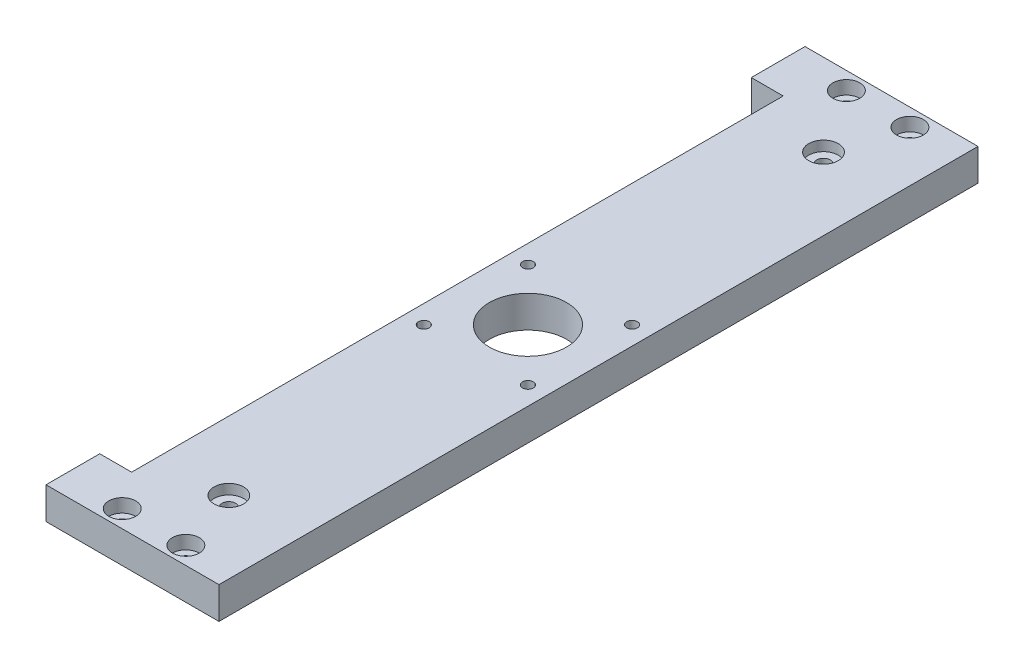
ISO-10303-21;
HEADER;
FILE_DESCRIPTION(('STEP AP214'),'2;1');
FILE_NAME('part.step','',(''),(''),'','','');
FILE_SCHEMA(('AUTOMOTIVE_DESIGN { 1 0 10303 214 1 1 1 1 }'));
ENDSEC;
DATA;
#1=APPLICATION_CONTEXT('core data for automotive mechanical design processes');
#2=APPLICATION_PROTOCOL_DEFINITION('international standard','automotive_design',2000,#1);
#3=PRODUCT_CONTEXT('',#1,'mechanical');
#4=PRODUCT('Part','Part','',(#3));
#5=PRODUCT_RELATED_PRODUCT_CATEGORY('part','',(#4));
#6=PRODUCT_DEFINITION_FORMATION('','',#4);
#7=PRODUCT_DEFINITION_CONTEXT('part definition',#1,'design');
#8=PRODUCT_DEFINITION('design','',#6,#7);
#9=PRODUCT_DEFINITION_SHAPE('','',#8);
#10=(LENGTH_UNIT() NAMED_UNIT(*) SI_UNIT(.MILLI.,.METRE.));
#11=(NAMED_UNIT(*) PLANE_ANGLE_UNIT() SI_UNIT($,.RADIAN.));
#12=(NAMED_UNIT(*) SI_UNIT($,.STERADIAN.) SOLID_ANGLE_UNIT());
#13=UNCERTAINTY_MEASURE_WITH_UNIT(LENGTH_MEASURE(1.E-05),#10,'distance_accuracy_value','');
#14=(GEOMETRIC_REPRESENTATION_CONTEXT(3) GLOBAL_UNCERTAINTY_ASSIGNED_CONTEXT((#13)) GLOBAL_UNIT_ASSIGNED_CONTEXT((#10,
#11,#12)) REPRESENTATION_CONTEXT('',''));
#15=CARTESIAN_POINT('',(0.,0.,0.));
#16=DIRECTION('',(0.,0.,1.));
#17=DIRECTION('',(1.,0.,0.));
#18=AXIS2_PLACEMENT_3D('',#15,#16,#17);
#19=CARTESIAN_POINT('',(26.9389173415036,0.,5.20000000000004));
#20=DIRECTION('',(0.,1.,0.));
#21=DIRECTION('',(0.,0.,1.));
#22=AXIS2_PLACEMENT_3D('',#19,#20,#21);
#23=CYLINDRICAL_SURFACE('',#22,1.9);
#24=CARTESIAN_POINT('',(26.9389173415036,0.,5.20000000000004));
#25=DIRECTION('',(0.,-1.,0.));
#26=DIRECTION('',(0.,0.,-1.));
#27=AXIS2_PLACEMENT_3D('',#24,#25,#26);
#28=CIRCLE('',#27,1.9);
#29=CARTESIAN_POINT('',(26.9389173415036,0.,3.30000000000004));
#30=VERTEX_POINT('',#29);
#31=EDGE_CURVE('E195',#30,#30,#28,.T.);
#32=ORIENTED_EDGE('',*,*,#31,.T.);
#33=EDGE_LOOP('',(#32));
#34=FACE_BOUND('',#33,.T.);
#35=CARTESIAN_POINT('',(26.9389173415036,5.5,5.20000000000004));
#36=DIRECTION('',(0.,1.,0.));
#37=DIRECTION('',(0.,0.,1.));
#38=AXIS2_PLACEMENT_3D('',#35,#36,#37);
#39=CIRCLE('',#38,1.9);
#40=CARTESIAN_POINT('',(26.9389173415036,5.5,7.10000000000004));
#41=VERTEX_POINT('',#40);
#42=EDGE_CURVE('E39',#41,#41,#39,.T.);
#43=ORIENTED_EDGE('',*,*,#42,.T.);
#44=EDGE_LOOP('',(#43));
#45=FACE_BOUND('',#44,.T.);
#46=ADVANCED_FACE('F35',(#34,#45),#23,.F.);
#47=CARTESIAN_POINT('',(8.00000000000001,0.,5.20000000000004));
#48=DIRECTION('',(0.,1.,0.));
#49=DIRECTION('',(0.,0.,1.));
#50=AXIS2_PLACEMENT_3D('',#47,#48,#49);
#51=CYLINDRICAL_SURFACE('',#50,1.9);
#52=CARTESIAN_POINT('',(8.00000000000001,0.,5.20000000000004));
#53=DIRECTION('',(0.,-1.,0.));
#54=DIRECTION('',(0.,0.,-1.));
#55=AXIS2_PLACEMENT_3D('',#52,#53,#54);
#56=CIRCLE('',#55,1.9);
#57=CARTESIAN_POINT('',(8.00000000000001,0.,3.30000000000003));
#58=VERTEX_POINT('',#57);
#59=EDGE_CURVE('E210',#58,#58,#56,.T.);
#60=ORIENTED_EDGE('',*,*,#59,.T.);
#61=EDGE_LOOP('',(#60));
#62=FACE_BOUND('',#61,.T.);
#63=CARTESIAN_POINT('',(8.00000000000001,5.5,5.20000000000004));
#64=DIRECTION('',(0.,1.,0.));
#65=DIRECTION('',(0.,0.,1.));
#66=AXIS2_PLACEMENT_3D('',#63,#64,#65);
#67=CIRCLE('',#66,1.9);
#68=CARTESIAN_POINT('',(8.00000000000001,5.5,7.10000000000004));
#69=VERTEX_POINT('',#68);
#70=EDGE_CURVE('E189',#69,#69,#67,.T.);
#71=ORIENTED_EDGE('',*,*,#70,.T.);
#72=EDGE_LOOP('',(#71));
#73=FACE_BOUND('',#72,.T.);
#74=ADVANCED_FACE('F297',(#62,#73),#51,.F.);
#75=CARTESIAN_POINT('',(26.9389173415036,0.,220.8));
#76=DIRECTION('',(0.,1.,0.));
#77=DIRECTION('',(0.,0.,1.));
#78=AXIS2_PLACEMENT_3D('',#75,#76,#77);
#79=CYLINDRICAL_SURFACE('',#78,1.9);
#80=CARTESIAN_POINT('',(26.9389173415036,0.,220.8));
#81=DIRECTION('',(0.,1.,0.));
#82=DIRECTION('',(0.,0.,1.));
#83=AXIS2_PLACEMENT_3D('',#80,#81,#82);
#84=CIRCLE('',#83,1.9);
#85=CARTESIAN_POINT('',(26.9389173415036,0.,222.7));
#86=VERTEX_POINT('',#85);
#87=EDGE_CURVE('E188',#86,#86,#84,.T.);
#88=ORIENTED_EDGE('',*,*,#87,.F.);
#89=EDGE_LOOP('',(#88));
#90=FACE_BOUND('',#89,.T.);
#91=CARTESIAN_POINT('',(26.9389173415036,5.5,220.8));
#92=DIRECTION('',(0.,1.,0.));
#93=DIRECTION('',(0.,0.,1.));
#94=AXIS2_PLACEMENT_3D('',#91,#92,#93);
#95=CIRCLE('',#94,1.9);
#96=CARTESIAN_POINT('',(26.9389173415036,5.5,222.7));
#97=VERTEX_POINT('',#96);
#98=EDGE_CURVE('E185',#97,#97,#95,.F.);
#99=ORIENTED_EDGE('',*,*,#98,.F.);
#100=EDGE_LOOP('',(#99));
#101=FACE_BOUND('',#100,.T.);
#102=ADVANCED_FACE('F304',(#90,#101),#79,.F.);
#103=CARTESIAN_POINT('',(8.00000000000001,0.,220.8));
#104=DIRECTION('',(0.,1.,0.));
#105=DIRECTION('',(0.,0.,1.));
#106=AXIS2_PLACEMENT_3D('',#103,#104,#105);
#107=CYLINDRICAL_SURFACE('',#106,1.9);
#108=CARTESIAN_POINT('',(8.00000000000001,0.,220.8));
#109=DIRECTION('',(0.,1.,0.));
#110=DIRECTION('',(0.,0.,1.));
#111=AXIS2_PLACEMENT_3D('',#108,#109,#110);
#112=CIRCLE('',#111,1.9);
#113=CARTESIAN_POINT('',(8.00000000000001,0.,222.7));
#114=VERTEX_POINT('',#113);
#115=EDGE_CURVE('E226',#114,#114,#112,.T.);
#116=ORIENTED_EDGE('',*,*,#115,.F.);
#117=EDGE_LOOP('',(#116));
#118=FACE_BOUND('',#117,.T.);
#119=CARTESIAN_POINT('',(8.00000000000001,5.5,220.8));
#120=DIRECTION('',(0.,1.,0.));
#121=DIRECTION('',(0.,0.,1.));
#122=AXIS2_PLACEMENT_3D('',#119,#120,#121);
#123=CIRCLE('',#122,1.9);
#124=CARTESIAN_POINT('',(8.00000000000001,5.5,222.7));
#125=VERTEX_POINT('',#124);
#126=EDGE_CURVE('E182',#125,#125,#123,.F.);
#127=ORIENTED_EDGE('',*,*,#126,.F.);
#128=EDGE_LOOP('',(#127));
#129=FACE_BOUND('',#128,.T.);
#130=ADVANCED_FACE('F328',(#118,#129),#107,.F.);
#131=CARTESIAN_POINT('',(0.,9.5,0.));
#132=DIRECTION('',(1.,0.,0.));
#133=DIRECTION('',(0.,0.,-1.));
#134=AXIS2_PLACEMENT_3D('',#131,#132,#133);
#135=PLANE('',#134);
#136=DIRECTION('',(0.,-1.,0.));
#137=VECTOR('',#136,1.);
#138=CARTESIAN_POINT('',(0.,0.,210.));
#139=LINE('',#138,#137);
#140=CARTESIAN_POINT('',(0.,9.5,210.));
#141=VERTEX_POINT('',#140);
#142=CARTESIAN_POINT('',(0.,0.,210.));
#143=VERTEX_POINT('',#142);
#144=EDGE_CURVE('E52',#141,#143,#139,.T.);
#145=ORIENTED_EDGE('',*,*,#144,.F.);
#146=DIRECTION('',(0.,0.,1.));
#147=VECTOR('',#146,1.);
#148=CARTESIAN_POINT('',(0.,9.5,0.));
#149=LINE('',#148,#147);
#150=CARTESIAN_POINT('',(0.,9.5,16.));
#151=VERTEX_POINT('',#150);
#152=EDGE_CURVE('E108',#151,#141,#149,.T.);
#153=ORIENTED_EDGE('',*,*,#152,.F.);
#154=DIRECTION('',(0.,1.,0.));
#155=VECTOR('',#154,1.);
#156=CARTESIAN_POINT('',(0.,9.5,16.));
#157=LINE('',#156,#155);
#158=CARTESIAN_POINT('',(0.,0.,16.));
#159=VERTEX_POINT('',#158);
#160=EDGE_CURVE('E136',#159,#151,#157,.T.);
#161=ORIENTED_EDGE('',*,*,#160,.F.);
#162=DIRECTION('',(0.,0.,1.));
#163=VECTOR('',#162,1.);
#164=CARTESIAN_POINT('',(0.,0.,0.));
#165=LINE('',#164,#163);
#166=EDGE_CURVE('E57',#159,#143,#165,.T.);
#167=ORIENTED_EDGE('',*,*,#166,.T.);
#168=EDGE_LOOP('',(#145,#153,#161,#167));
#169=FACE_BOUND('',#168,.T.);
#170=ADVANCED_FACE('F37',(#169),#135,.F.);
#171=CARTESIAN_POINT('',(0.,9.5,226.));
#172=DIRECTION('',(0.,0.,-1.));
#173=DIRECTION('',(-1.,0.,0.));
#174=AXIS2_PLACEMENT_3D('',#171,#172,#173);
#175=PLANE('',#174);
#176=DIRECTION('',(1.,0.,0.));
#177=VECTOR('',#176,1.);
#178=CARTESIAN_POINT('',(0.,0.,226.));
#179=LINE('',#178,#177);
#180=CARTESIAN_POINT('',(-9.49999999999993,0.,226.));
#181=VERTEX_POINT('',#180);
#182=CARTESIAN_POINT('',(42.0000000000001,0.,226.));
#183=VERTEX_POINT('',#182);
#184=EDGE_CURVE('E167',#181,#183,#179,.T.);
#185=ORIENTED_EDGE('',*,*,#184,.T.);
#186=DIRECTION('',(0.,-1.,0.));
#187=VECTOR('',#186,1.);
#188=CARTESIAN_POINT('',(42.0000000000001,9.5,226.));
#189=LINE('',#188,#187);
#190=CARTESIAN_POINT('',(42.0000000000001,9.5,226.));
#191=VERTEX_POINT('',#190);
#192=EDGE_CURVE('E11',#191,#183,#189,.T.);
#193=ORIENTED_EDGE('',*,*,#192,.F.);
#194=DIRECTION('',(1.,0.,0.));
#195=VECTOR('',#194,1.);
#196=CARTESIAN_POINT('',(0.,9.5,226.));
#197=LINE('',#196,#195);
#198=CARTESIAN_POINT('',(-9.49999999999993,9.5,226.));
#199=VERTEX_POINT('',#198);
#200=EDGE_CURVE('E100',#199,#191,#197,.T.);
#201=ORIENTED_EDGE('',*,*,#200,.F.);
#202=DIRECTION('',(0.,1.,0.));
#203=VECTOR('',#202,1.);
#204=CARTESIAN_POINT('',(-9.49999999999993,0.,226.));
#205=LINE('',#204,#203);
#206=EDGE_CURVE('E104',#181,#199,#205,.T.);
#207=ORIENTED_EDGE('',*,*,#206,.F.);
#208=EDGE_LOOP('',(#185,#193,#201,#207));
#209=FACE_BOUND('',#208,.T.);
#210=ADVANCED_FACE('F102',(#209),#175,.F.);
#211=CARTESIAN_POINT('',(42.,9.5,0.));
#212=DIRECTION('',(-1.,0.,0.));
#213=DIRECTION('',(0.,0.,1.));
#214=AXIS2_PLACEMENT_3D('',#211,#212,#213);
#215=PLANE('',#214);
#216=DIRECTION('',(0.,0.,-1.));
#217=VECTOR('',#216,1.);
#218=CARTESIAN_POINT('',(42.,0.,0.));
#219=LINE('',#218,#217);
#220=CARTESIAN_POINT('',(42.,0.,0.));
#221=VERTEX_POINT('',#220);
#222=EDGE_CURVE('E169',#183,#221,#219,.T.);
#223=ORIENTED_EDGE('',*,*,#222,.T.);
#224=DIRECTION('',(0.,-1.,0.));
#225=VECTOR('',#224,1.);
#226=CARTESIAN_POINT('',(42.,9.5,0.));
#227=LINE('',#226,#225);
#228=CARTESIAN_POINT('',(42.,9.5,0.));
#229=VERTEX_POINT('',#228);
#230=EDGE_CURVE('E44',#229,#221,#227,.T.);
#231=ORIENTED_EDGE('',*,*,#230,.F.);
#232=DIRECTION('',(0.,0.,-1.));
#233=VECTOR('',#232,1.);
#234=CARTESIAN_POINT('',(42.,9.5,0.));
#235=LINE('',#234,#233);
#236=EDGE_CURVE('E107',#191,#229,#235,.T.);
#237=ORIENTED_EDGE('',*,*,#236,.F.);
#238=ORIENTED_EDGE('',*,*,#192,.T.);
#239=EDGE_LOOP('',(#223,#231,#237,#238));
#240=FACE_BOUND('',#239,.T.);
#241=ADVANCED_FACE('F395',(#240),#215,.F.);
#242=CARTESIAN_POINT('',(0.,9.5,0.));
#243=DIRECTION('',(0.,0.,1.));
#244=DIRECTION('',(1.,0.,0.));
#245=AXIS2_PLACEMENT_3D('',#242,#243,#244);
#246=PLANE('',#245);
#247=DIRECTION('',(-1.,0.,0.));
#248=VECTOR('',#247,1.);
#249=CARTESIAN_POINT('',(0.,0.,0.));
#250=LINE('',#249,#248);
#251=CARTESIAN_POINT('',(-9.5,0.,0.));
#252=VERTEX_POINT('',#251);
#253=EDGE_CURVE('E161',#221,#252,#250,.T.);
#254=ORIENTED_EDGE('',*,*,#253,.T.);
#255=DIRECTION('',(0.,-1.,0.));
#256=VECTOR('',#255,1.);
#257=CARTESIAN_POINT('',(-9.5,9.5,0.));
#258=LINE('',#257,#256);
#259=CARTESIAN_POINT('',(-9.5,9.5,0.));
#260=VERTEX_POINT('',#259);
#261=EDGE_CURVE('E137',#260,#252,#258,.T.);
#262=ORIENTED_EDGE('',*,*,#261,.F.);
#263=DIRECTION('',(-1.,0.,0.));
#264=VECTOR('',#263,1.);
#265=CARTESIAN_POINT('',(0.,9.5,0.));
#266=LINE('',#265,#264);
#267=EDGE_CURVE('E164',#229,#260,#266,.T.);
#268=ORIENTED_EDGE('',*,*,#267,.F.);
#269=ORIENTED_EDGE('',*,*,#230,.T.);
#270=EDGE_LOOP('',(#254,#262,#268,#269));
#271=FACE_BOUND('',#270,.T.);
#272=ADVANCED_FACE('F275',(#271),#246,.F.);
#273=CARTESIAN_POINT('',(0.,9.5,0.));
#274=DIRECTION('',(0.,1.,0.));
#275=DIRECTION('',(0.,0.,1.));
#276=AXIS2_PLACEMENT_3D('',#273,#274,#275);
#277=PLANE('',#276);
#278=CARTESIAN_POINT('',(8.00000000000001,9.5,5.20000000000004));
#279=DIRECTION('',(0.,-1.,0.));
#280=DIRECTION('',(0.,0.,-1.));
#281=AXIS2_PLACEMENT_3D('',#278,#279,#280);
#282=CIRCLE('',#281,4.);
#283=CARTESIAN_POINT('',(8.00000000000001,9.5,1.20000000000004));
#284=VERTEX_POINT('',#283);
#285=EDGE_CURVE('E197',#284,#284,#282,.T.);
#286=ORIENTED_EDGE('',*,*,#285,.T.);
#287=EDGE_LOOP('',(#286));
#288=FACE_BOUND('',#287,.T.);
#289=CARTESIAN_POINT('',(26.9389173415036,9.5,5.20000000000004));
#290=DIRECTION('',(0.,-1.,0.));
#291=DIRECTION('',(0.,0.,-1.));
#292=AXIS2_PLACEMENT_3D('',#289,#290,#291);
#293=CIRCLE('',#292,4.);
#294=CARTESIAN_POINT('',(26.9389173415036,9.5,1.20000000000004));
#295=VERTEX_POINT('',#294);
#296=EDGE_CURVE('E207',#295,#295,#293,.T.);
#297=ORIENTED_EDGE('',*,*,#296,.T.);
#298=EDGE_LOOP('',(#297));
#299=FACE_BOUND('',#298,.T.);
#300=CARTESIAN_POINT('',(8.00000000000001,9.5,220.8));
#301=DIRECTION('',(0.,1.,0.));
#302=DIRECTION('',(0.,0.,1.));
#303=AXIS2_PLACEMENT_3D('',#300,#301,#302);
#304=CIRCLE('',#303,4.);
#305=CARTESIAN_POINT('',(8.00000000000001,9.5,224.8));
#306=VERTEX_POINT('',#305);
#307=EDGE_CURVE('E218',#306,#306,#304,.T.);
#308=ORIENTED_EDGE('',*,*,#307,.F.);
#309=EDGE_LOOP('',(#308));
#310=FACE_BOUND('',#309,.T.);
#311=CARTESIAN_POINT('',(26.9389173415036,9.5,220.8));
#312=DIRECTION('',(0.,1.,0.));
#313=DIRECTION('',(0.,0.,1.));
#314=AXIS2_PLACEMENT_3D('',#311,#312,#313);
#315=CIRCLE('',#314,4.);
#316=CARTESIAN_POINT('',(26.9389173415036,9.5,224.8));
#317=VERTEX_POINT('',#316);
#318=EDGE_CURVE('E213',#317,#317,#315,.T.);
#319=ORIENTED_EDGE('',*,*,#318,.F.);
#320=EDGE_LOOP('',(#319));
#321=FACE_BOUND('',#320,.T.);
#322=CARTESIAN_POINT('',(5.49999999999916,9.5,128.5));
#323=DIRECTION('',(0.,-1.,0.));
#324=DIRECTION('',(0.,0.,-1.));
#325=AXIS2_PLACEMENT_3D('',#322,#323,#324);
#326=CIRCLE('',#325,1.6);
#327=CARTESIAN_POINT('',(5.49999999999916,9.5,126.9));
#328=VERTEX_POINT('',#327);
#329=EDGE_CURVE('E242',#328,#328,#326,.T.);
#330=ORIENTED_EDGE('',*,*,#329,.T.);
#331=EDGE_LOOP('',(#330));
#332=FACE_BOUND('',#331,.T.);
#333=CARTESIAN_POINT('',(36.5,9.5,97.5000000000009));
#334=DIRECTION('',(0.,-1.,0.));
#335=DIRECTION('',(0.,0.,-1.));
#336=AXIS2_PLACEMENT_3D('',#333,#334,#335);
#337=CIRCLE('',#336,1.6);
#338=CARTESIAN_POINT('',(36.5,9.5,95.9000000000009));
#339=VERTEX_POINT('',#338);
#340=EDGE_CURVE('E249',#339,#339,#337,.T.);
#341=ORIENTED_EDGE('',*,*,#340,.T.);
#342=EDGE_LOOP('',(#341));
#343=FACE_BOUND('',#342,.T.);
#344=CARTESIAN_POINT('',(36.4999999999992,9.5,128.500000000001));
#345=DIRECTION('',(0.,-1.,0.));
#346=DIRECTION('',(0.,0.,-1.));
#347=AXIS2_PLACEMENT_3D('',#344,#345,#346);
#348=CIRCLE('',#347,1.6);
#349=CARTESIAN_POINT('',(36.4999999999992,9.5,126.900000000001));
#350=VERTEX_POINT('',#349);
#351=EDGE_CURVE('E236',#350,#350,#348,.T.);
#352=ORIENTED_EDGE('',*,*,#351,.T.);
#353=EDGE_LOOP('',(#352));
#354=FACE_BOUND('',#353,.T.);
#355=CARTESIAN_POINT('',(5.50000000000004,9.5,97.5));
#356=DIRECTION('',(0.,-1.,0.));
#357=DIRECTION('',(0.,0.,-1.));
#358=AXIS2_PLACEMENT_3D('',#355,#356,#357);
#359=CIRCLE('',#358,1.6);
#360=CARTESIAN_POINT('',(5.50000000000004,9.5,95.9));
#361=VERTEX_POINT('',#360);
#362=EDGE_CURVE('E254',#361,#361,#359,.T.);
#363=ORIENTED_EDGE('',*,*,#362,.T.);
#364=EDGE_LOOP('',(#363));
#365=FACE_BOUND('',#364,.T.);
#366=CARTESIAN_POINT('',(20.4700000000034,9.5,201.526194604116));
#367=DIRECTION('',(0.,1.,0.));
#368=DIRECTION('',(0.,0.,1.));
#369=AXIS2_PLACEMENT_3D('',#366,#367,#368);
#370=CIRCLE('',#369,4.39999999999999);
#371=CARTESIAN_POINT('',(20.4700000000034,9.5,205.926194604116));
#372=VERTEX_POINT('',#371);
#373=EDGE_CURVE('E261',#372,#372,#370,.T.);
#374=ORIENTED_EDGE('',*,*,#373,.F.);
#375=EDGE_LOOP('',(#374));
#376=FACE_BOUND('',#375,.T.);
#377=CARTESIAN_POINT('',(20.4699999999966,9.5,24.4738053958861));
#378=DIRECTION('',(0.,1.,0.));
#379=DIRECTION('',(0.,0.,1.));
#380=AXIS2_PLACEMENT_3D('',#377,#378,#379);
#381=CIRCLE('',#380,4.4);
#382=CARTESIAN_POINT('',(20.4699999999966,9.5,28.8738053958861));
#383=VERTEX_POINT('',#382);
#384=EDGE_CURVE('E127',#383,#383,#381,.T.);
#385=ORIENTED_EDGE('',*,*,#384,.F.);
#386=EDGE_LOOP('',(#385));
#387=FACE_BOUND('',#386,.T.);
#388=CARTESIAN_POINT('',(21.,9.5,113.));
#389=DIRECTION('',(0.,1.,0.));
#390=DIRECTION('',(0.,0.,1.));
#391=AXIS2_PLACEMENT_3D('',#388,#389,#390);
#392=CIRCLE('',#391,11.5);
#393=CARTESIAN_POINT('',(21.,9.5,124.5));
#394=VERTEX_POINT('',#393);
#395=EDGE_CURVE('E155',#394,#394,#392,.T.);
#396=ORIENTED_EDGE('',*,*,#395,.F.);
#397=EDGE_LOOP('',(#396));
#398=FACE_BOUND('',#397,.T.);
#399=ORIENTED_EDGE('',*,*,#267,.T.);
#400=DIRECTION('',(0.,0.,-1.));
#401=VECTOR('',#400,1.);
#402=CARTESIAN_POINT('',(-9.5,9.5,0.));
#403=LINE('',#402,#401);
#404=CARTESIAN_POINT('',(-9.49999999999999,9.5,16.));
#405=VERTEX_POINT('',#404);
#406=EDGE_CURVE('E144',#405,#260,#403,.T.);
#407=ORIENTED_EDGE('',*,*,#406,.F.);
#408=DIRECTION('',(1.,0.,0.));
#409=VECTOR('',#408,1.);
#410=CARTESIAN_POINT('',(-9.49999999999999,9.5,16.));
#411=LINE('',#410,#409);
#412=EDGE_CURVE('E147',#405,#151,#411,.T.);
#413=ORIENTED_EDGE('',*,*,#412,.T.);
#414=ORIENTED_EDGE('',*,*,#152,.T.);
#415=DIRECTION('',(1.,0.,0.));
#416=VECTOR('',#415,1.);
#417=CARTESIAN_POINT('',(-9.49999999999993,9.5,210.));
#418=LINE('',#417,#416);
#419=CARTESIAN_POINT('',(-9.49999999999993,9.5,210.));
#420=VERTEX_POINT('',#419);
#421=EDGE_CURVE('E114',#420,#141,#418,.T.);
#422=ORIENTED_EDGE('',*,*,#421,.F.);
#423=DIRECTION('',(0.,0.,-1.));
#424=VECTOR('',#423,1.);
#425=CARTESIAN_POINT('',(-9.49999999999993,9.5,226.));
#426=LINE('',#425,#424);
#427=EDGE_CURVE('E111',#199,#420,#426,.T.);
#428=ORIENTED_EDGE('',*,*,#427,.F.);
#429=ORIENTED_EDGE('',*,*,#200,.T.);
#430=ORIENTED_EDGE('',*,*,#236,.T.);
#431=EDGE_LOOP('',(#399,#407,#413,#414,#422,#428,#429,#430));
#432=FACE_BOUND('',#431,.T.);
#433=ADVANCED_FACE('F112',(#288,#299,#310,#321,#332,#343,#354,#365,#376,#387,#398,#432),#277,.T.);
#434=CARTESIAN_POINT('',(0.,0.,0.));
#435=DIRECTION('',(0.,1.,0.));
#436=DIRECTION('',(0.,0.,1.));
#437=AXIS2_PLACEMENT_3D('',#434,#435,#436);
#438=PLANE('',#437);
#439=ORIENTED_EDGE('',*,*,#59,.F.);
#440=EDGE_LOOP('',(#439));
#441=FACE_BOUND('',#440,.T.);
#442=ORIENTED_EDGE('',*,*,#31,.F.);
#443=EDGE_LOOP('',(#442));
#444=FACE_BOUND('',#443,.T.);
#445=ORIENTED_EDGE('',*,*,#115,.T.);
#446=EDGE_LOOP('',(#445));
#447=FACE_BOUND('',#446,.T.);
#448=ORIENTED_EDGE('',*,*,#87,.T.);
#449=EDGE_LOOP('',(#448));
#450=FACE_BOUND('',#449,.T.);
#451=CARTESIAN_POINT('',(20.4700000000034,0.,201.526194604116));
#452=DIRECTION('',(0.,1.,0.));
#453=DIRECTION('',(0.,0.,1.));
#454=AXIS2_PLACEMENT_3D('',#451,#452,#453);
#455=CIRCLE('',#454,2.);
#456=CARTESIAN_POINT('',(20.4700000000034,0.,203.526194604116));
#457=VERTEX_POINT('',#456);
#458=EDGE_CURVE('E178',#457,#457,#455,.T.);
#459=ORIENTED_EDGE('',*,*,#458,.T.);
#460=EDGE_LOOP('',(#459));
#461=FACE_BOUND('',#460,.T.);
#462=CARTESIAN_POINT('',(20.4699999999966,0.,24.4738053958861));
#463=DIRECTION('',(0.,1.,0.));
#464=DIRECTION('',(0.,0.,1.));
#465=AXIS2_PLACEMENT_3D('',#462,#463,#464);
#466=CIRCLE('',#465,2.00000000000001);
#467=CARTESIAN_POINT('',(20.4699999999966,0.,26.4738053958861));
#468=VERTEX_POINT('',#467);
#469=EDGE_CURVE('E229',#468,#468,#466,.T.);
#470=ORIENTED_EDGE('',*,*,#469,.T.);
#471=EDGE_LOOP('',(#470));
#472=FACE_BOUND('',#471,.T.);
#473=CARTESIAN_POINT('',(5.49999999999916,0.,128.5));
#474=DIRECTION('',(0.,-1.,0.));
#475=DIRECTION('',(0.,0.,-1.));
#476=AXIS2_PLACEMENT_3D('',#473,#474,#475);
#477=CIRCLE('',#476,1.6);
#478=CARTESIAN_POINT('',(5.49999999999916,0.,126.9));
#479=VERTEX_POINT('',#478);
#480=EDGE_CURVE('E246',#479,#479,#477,.T.);
#481=ORIENTED_EDGE('',*,*,#480,.F.);
#482=EDGE_LOOP('',(#481));
#483=FACE_BOUND('',#482,.T.);
#484=CARTESIAN_POINT('',(36.5,0.,97.5000000000009));
#485=DIRECTION('',(0.,-1.,0.));
#486=DIRECTION('',(0.,0.,-1.));
#487=AXIS2_PLACEMENT_3D('',#484,#485,#486);
#488=CIRCLE('',#487,1.6);
#489=CARTESIAN_POINT('',(36.5,0.,95.9000000000009));
#490=VERTEX_POINT('',#489);
#491=EDGE_CURVE('E239',#490,#490,#488,.T.);
#492=ORIENTED_EDGE('',*,*,#491,.F.);
#493=EDGE_LOOP('',(#492));
#494=FACE_BOUND('',#493,.T.);
#495=CARTESIAN_POINT('',(36.4999999999992,0.,128.500000000001));
#496=DIRECTION('',(0.,-1.,0.));
#497=DIRECTION('',(0.,0.,-1.));
#498=AXIS2_PLACEMENT_3D('',#495,#496,#497);
#499=CIRCLE('',#498,1.6);
#500=CARTESIAN_POINT('',(36.4999999999992,0.,126.900000000001));
#501=VERTEX_POINT('',#500);
#502=EDGE_CURVE('E181',#501,#501,#499,.T.);
#503=ORIENTED_EDGE('',*,*,#502,.F.);
#504=EDGE_LOOP('',(#503));
#505=FACE_BOUND('',#504,.T.);
#506=CARTESIAN_POINT('',(5.50000000000004,0.,97.5));
#507=DIRECTION('',(0.,-1.,0.));
#508=DIRECTION('',(0.,0.,-1.));
#509=AXIS2_PLACEMENT_3D('',#506,#507,#508);
#510=CIRCLE('',#509,1.6);
#511=CARTESIAN_POINT('',(5.50000000000004,0.,95.9));
#512=VERTEX_POINT('',#511);
#513=EDGE_CURVE('E245',#512,#512,#510,.T.);
#514=ORIENTED_EDGE('',*,*,#513,.F.);
#515=EDGE_LOOP('',(#514));
#516=FACE_BOUND('',#515,.T.);
#517=CARTESIAN_POINT('',(21.,0.,113.));
#518=DIRECTION('',(0.,1.,0.));
#519=DIRECTION('',(0.,0.,1.));
#520=AXIS2_PLACEMENT_3D('',#517,#518,#519);
#521=CIRCLE('',#520,11.5);
#522=CARTESIAN_POINT('',(21.,0.,124.5));
#523=VERTEX_POINT('',#522);
#524=EDGE_CURVE('E156',#523,#523,#521,.T.);
#525=ORIENTED_EDGE('',*,*,#524,.T.);
#526=EDGE_LOOP('',(#525));
#527=FACE_BOUND('',#526,.T.);
#528=ORIENTED_EDGE('',*,*,#166,.F.);
#529=DIRECTION('',(1.,0.,0.));
#530=VECTOR('',#529,1.);
#531=CARTESIAN_POINT('',(-9.49999999999999,0.,16.));
#532=LINE('',#531,#530);
#533=CARTESIAN_POINT('',(-9.49999999999999,0.,16.));
#534=VERTEX_POINT('',#533);
#535=EDGE_CURVE('E152',#534,#159,#532,.T.);
#536=ORIENTED_EDGE('',*,*,#535,.F.);
#537=DIRECTION('',(0.,0.,1.));
#538=VECTOR('',#537,1.);
#539=CARTESIAN_POINT('',(-9.5,0.,0.));
#540=LINE('',#539,#538);
#541=EDGE_CURVE('E140',#252,#534,#540,.T.);
#542=ORIENTED_EDGE('',*,*,#541,.F.);
#543=ORIENTED_EDGE('',*,*,#253,.F.);
#544=ORIENTED_EDGE('',*,*,#222,.F.);
#545=ORIENTED_EDGE('',*,*,#184,.F.);
#546=DIRECTION('',(0.,0.,1.));
#547=VECTOR('',#546,1.);
#548=CARTESIAN_POINT('',(-9.49999999999993,0.,226.));
#549=LINE('',#548,#547);
#550=CARTESIAN_POINT('',(-9.49999999999993,0.,210.));
#551=VERTEX_POINT('',#550);
#552=EDGE_CURVE('E122',#551,#181,#549,.T.);
#553=ORIENTED_EDGE('',*,*,#552,.F.);
#554=DIRECTION('',(1.,0.,0.));
#555=VECTOR('',#554,1.);
#556=CARTESIAN_POINT('',(-9.49999999999993,0.,210.));
#557=LINE('',#556,#555);
#558=EDGE_CURVE('E131',#551,#143,#557,.T.);
#559=ORIENTED_EDGE('',*,*,#558,.T.);
#560=EDGE_LOOP('',(#528,#536,#542,#543,#544,#545,#553,#559));
#561=FACE_BOUND('',#560,.T.);
#562=ADVANCED_FACE('F274',(#441,#444,#447,#450,#461,#472,#483,#494,#505,#516,#527,#561),#438,.F.);
#563=CARTESIAN_POINT('',(21.,0.,113.));
#564=DIRECTION('',(0.,1.,0.));
#565=DIRECTION('',(0.,0.,1.));
#566=AXIS2_PLACEMENT_3D('',#563,#564,#565);
#567=CYLINDRICAL_SURFACE('',#566,11.5);
#568=ORIENTED_EDGE('',*,*,#524,.F.);
#569=EDGE_LOOP('',(#568));
#570=FACE_BOUND('',#569,.T.);
#571=ORIENTED_EDGE('',*,*,#395,.T.);
#572=EDGE_LOOP('',(#571));
#573=FACE_BOUND('',#572,.T.);
#574=ADVANCED_FACE('F280',(#570,#573),#567,.F.);
#575=CARTESIAN_POINT('',(-9.49999999999999,9.5,16.));
#576=DIRECTION('',(0.,0.,-1.));
#577=DIRECTION('',(0.,1.,0.));
#578=AXIS2_PLACEMENT_3D('',#575,#576,#577);
#579=PLANE('',#578);
#580=ORIENTED_EDGE('',*,*,#160,.T.);
#581=ORIENTED_EDGE('',*,*,#412,.F.);
#582=DIRECTION('',(0.,1.,0.));
#583=VECTOR('',#582,1.);
#584=CARTESIAN_POINT('',(-9.49999999999999,9.5,16.));
#585=LINE('',#584,#583);
#586=EDGE_CURVE('E142',#534,#405,#585,.T.);
#587=ORIENTED_EDGE('',*,*,#586,.F.);
#588=ORIENTED_EDGE('',*,*,#535,.T.);
#589=EDGE_LOOP('',(#580,#581,#587,#588));
#590=FACE_BOUND('',#589,.T.);
#591=ADVANCED_FACE('F282',(#590),#579,.F.);
#592=CARTESIAN_POINT('',(-9.5,0.,0.));
#593=DIRECTION('',(-1.,0.,0.));
#594=DIRECTION('',(0.,0.,1.));
#595=AXIS2_PLACEMENT_3D('',#592,#593,#594);
#596=PLANE('',#595);
#597=ORIENTED_EDGE('',*,*,#261,.T.);
#598=ORIENTED_EDGE('',*,*,#541,.T.);
#599=ORIENTED_EDGE('',*,*,#586,.T.);
#600=ORIENTED_EDGE('',*,*,#406,.T.);
#601=EDGE_LOOP('',(#597,#598,#599,#600));
#602=FACE_BOUND('',#601,.T.);
#603=ADVANCED_FACE('F289',(#602),#596,.T.);
#604=CARTESIAN_POINT('',(-9.49999999999993,0.,210.));
#605=DIRECTION('',(0.,0.,1.));
#606=DIRECTION('',(1.,0.,0.));
#607=AXIS2_PLACEMENT_3D('',#604,#605,#606);
#608=PLANE('',#607);
#609=ORIENTED_EDGE('',*,*,#144,.T.);
#610=ORIENTED_EDGE('',*,*,#558,.F.);
#611=DIRECTION('',(0.,-1.,0.));
#612=VECTOR('',#611,1.);
#613=CARTESIAN_POINT('',(-9.49999999999993,0.,210.));
#614=LINE('',#613,#612);
#615=EDGE_CURVE('E117',#420,#551,#614,.T.);
#616=ORIENTED_EDGE('',*,*,#615,.F.);
#617=ORIENTED_EDGE('',*,*,#421,.T.);
#618=EDGE_LOOP('',(#609,#610,#616,#617));
#619=FACE_BOUND('',#618,.T.);
#620=ADVANCED_FACE('F374',(#619),#608,.F.);
#621=CARTESIAN_POINT('',(-9.5,0.,0.));
#622=DIRECTION('',(-1.,0.,0.));
#623=DIRECTION('',(0.,0.,1.));
#624=AXIS2_PLACEMENT_3D('',#621,#622,#623);
#625=PLANE('',#624);
#626=ORIENTED_EDGE('',*,*,#206,.T.);
#627=ORIENTED_EDGE('',*,*,#427,.T.);
#628=ORIENTED_EDGE('',*,*,#615,.T.);
#629=ORIENTED_EDGE('',*,*,#552,.T.);
#630=EDGE_LOOP('',(#626,#627,#628,#629));
#631=FACE_BOUND('',#630,.T.);
#632=ADVANCED_FACE('F120',(#631),#625,.T.);
#633=CARTESIAN_POINT('',(20.4699999999966,6.5,24.4738053958861));
#634=DIRECTION('',(0.,1.,0.));
#635=DIRECTION('',(0.,0.,1.));
#636=AXIS2_PLACEMENT_3D('',#633,#634,#635);
#637=CYLINDRICAL_SURFACE('',#636,4.4);
#638=CARTESIAN_POINT('',(20.4699999999966,6.5,24.4738053958861));
#639=DIRECTION('',(0.,1.,0.));
#640=DIRECTION('',(0.,0.,1.));
#641=AXIS2_PLACEMENT_3D('',#638,#639,#640);
#642=CIRCLE('',#641,4.4);
#643=CARTESIAN_POINT('',(20.4699999999966,6.5,28.8738053958861));
#644=VERTEX_POINT('',#643);
#645=EDGE_CURVE('E263',#644,#644,#642,.T.);
#646=ORIENTED_EDGE('',*,*,#645,.F.);
#647=EDGE_LOOP('',(#646));
#648=FACE_BOUND('',#647,.T.);
#649=ORIENTED_EDGE('',*,*,#384,.T.);
#650=EDGE_LOOP('',(#649));
#651=FACE_BOUND('',#650,.T.);
#652=ADVANCED_FACE('F270',(#648,#651),#637,.F.);
#653=CARTESIAN_POINT('',(20.4699999999966,6.5,24.4738053958861));
#654=DIRECTION('',(0.,1.,0.));
#655=DIRECTION('',(0.,0.,1.));
#656=AXIS2_PLACEMENT_3D('',#653,#654,#655);
#657=PLANE('',#656);
#658=CARTESIAN_POINT('',(20.4699999999966,6.5,24.4738053958861));
#659=DIRECTION('',(0.,1.,0.));
#660=DIRECTION('',(0.,0.,1.));
#661=AXIS2_PLACEMENT_3D('',#658,#659,#660);
#662=CIRCLE('',#661,2.00000000000001);
#663=CARTESIAN_POINT('',(20.4699999999966,6.5,26.4738053958861));
#664=VERTEX_POINT('',#663);
#665=EDGE_CURVE('E177',#664,#664,#662,.T.);
#666=ORIENTED_EDGE('',*,*,#665,.F.);
#667=EDGE_LOOP('',(#666));
#668=FACE_BOUND('',#667,.T.);
#669=ORIENTED_EDGE('',*,*,#645,.T.);
#670=EDGE_LOOP('',(#669));
#671=FACE_BOUND('',#670,.T.);
#672=ADVANCED_FACE('F365',(#668,#671),#657,.T.);
#673=CARTESIAN_POINT('',(20.4700000000034,6.5,201.526194604116));
#674=DIRECTION('',(0.,1.,0.));
#675=DIRECTION('',(0.,0.,1.));
#676=AXIS2_PLACEMENT_3D('',#673,#674,#675);
#677=CYLINDRICAL_SURFACE('',#676,4.39999999999999);
#678=CARTESIAN_POINT('',(20.4700000000034,6.5,201.526194604116));
#679=DIRECTION('',(0.,1.,0.));
#680=DIRECTION('',(0.,0.,1.));
#681=AXIS2_PLACEMENT_3D('',#678,#679,#680);
#682=CIRCLE('',#681,4.39999999999999);
#683=CARTESIAN_POINT('',(20.4700000000034,6.5,205.926194604116));
#684=VERTEX_POINT('',#683);
#685=EDGE_CURVE('E124',#684,#684,#682,.T.);
#686=ORIENTED_EDGE('',*,*,#685,.F.);
#687=EDGE_LOOP('',(#686));
#688=FACE_BOUND('',#687,.T.);
#689=ORIENTED_EDGE('',*,*,#373,.T.);
#690=EDGE_LOOP('',(#689));
#691=FACE_BOUND('',#690,.T.);
#692=ADVANCED_FACE('F361',(#688,#691),#677,.F.);
#693=CARTESIAN_POINT('',(20.4700000000034,6.5,201.526194604116));
#694=DIRECTION('',(0.,1.,0.));
#695=DIRECTION('',(0.,0.,1.));
#696=AXIS2_PLACEMENT_3D('',#693,#694,#695);
#697=PLANE('',#696);
#698=CARTESIAN_POINT('',(20.4700000000034,6.5,201.526194604116));
#699=DIRECTION('',(0.,1.,0.));
#700=DIRECTION('',(0.,0.,1.));
#701=AXIS2_PLACEMENT_3D('',#698,#699,#700);
#702=CIRCLE('',#701,2.);
#703=CARTESIAN_POINT('',(20.4700000000034,6.5,203.526194604116));
#704=VERTEX_POINT('',#703);
#705=EDGE_CURVE('E174',#704,#704,#702,.T.);
#706=ORIENTED_EDGE('',*,*,#705,.F.);
#707=EDGE_LOOP('',(#706));
#708=FACE_BOUND('',#707,.T.);
#709=ORIENTED_EDGE('',*,*,#685,.T.);
#710=EDGE_LOOP('',(#709));
#711=FACE_BOUND('',#710,.T.);
#712=ADVANCED_FACE('F357',(#708,#711),#697,.T.);
#713=CARTESIAN_POINT('',(5.50000000000004,9.5,97.5));
#714=DIRECTION('',(0.,-1.,0.));
#715=DIRECTION('',(0.,0.,-1.));
#716=AXIS2_PLACEMENT_3D('',#713,#714,#715);
#717=CYLINDRICAL_SURFACE('',#716,1.6);
#718=ORIENTED_EDGE('',*,*,#362,.F.);
#719=EDGE_LOOP('',(#718));
#720=FACE_BOUND('',#719,.T.);
#721=ORIENTED_EDGE('',*,*,#513,.T.);
#722=EDGE_LOOP('',(#721));
#723=FACE_BOUND('',#722,.T.);
#724=ADVANCED_FACE('F347',(#720,#723),#717,.F.);
#725=CARTESIAN_POINT('',(36.4999999999992,9.5,128.500000000001));
#726=DIRECTION('',(0.,-1.,0.));
#727=DIRECTION('',(0.,0.,-1.));
#728=AXIS2_PLACEMENT_3D('',#725,#726,#727);
#729=CYLINDRICAL_SURFACE('',#728,1.6);
#730=ORIENTED_EDGE('',*,*,#351,.F.);
#731=EDGE_LOOP('',(#730));
#732=FACE_BOUND('',#731,.T.);
#733=ORIENTED_EDGE('',*,*,#502,.T.);
#734=EDGE_LOOP('',(#733));
#735=FACE_BOUND('',#734,.T.);
#736=ADVANCED_FACE('F343',(#732,#735),#729,.F.);
#737=CARTESIAN_POINT('',(36.5,9.5,97.5000000000009));
#738=DIRECTION('',(0.,-1.,0.));
#739=DIRECTION('',(0.,0.,-1.));
#740=AXIS2_PLACEMENT_3D('',#737,#738,#739);
#741=CYLINDRICAL_SURFACE('',#740,1.6);
#742=ORIENTED_EDGE('',*,*,#340,.F.);
#743=EDGE_LOOP('',(#742));
#744=FACE_BOUND('',#743,.T.);
#745=ORIENTED_EDGE('',*,*,#491,.T.);
#746=EDGE_LOOP('',(#745));
#747=FACE_BOUND('',#746,.T.);
#748=ADVANCED_FACE('F346',(#744,#747),#741,.F.);
#749=CARTESIAN_POINT('',(5.49999999999916,9.5,128.5));
#750=DIRECTION('',(0.,-1.,0.));
#751=DIRECTION('',(0.,0.,-1.));
#752=AXIS2_PLACEMENT_3D('',#749,#750,#751);
#753=CYLINDRICAL_SURFACE('',#752,1.6);
#754=ORIENTED_EDGE('',*,*,#329,.F.);
#755=EDGE_LOOP('',(#754));
#756=FACE_BOUND('',#755,.T.);
#757=ORIENTED_EDGE('',*,*,#480,.T.);
#758=EDGE_LOOP('',(#757));
#759=FACE_BOUND('',#758,.T.);
#760=ADVANCED_FACE('F338',(#756,#759),#753,.F.);
#761=CARTESIAN_POINT('',(20.4700000000034,0.,201.526194604116));
#762=DIRECTION('',(0.,1.,0.));
#763=DIRECTION('',(0.,0.,1.));
#764=AXIS2_PLACEMENT_3D('',#761,#762,#763);
#765=CYLINDRICAL_SURFACE('',#764,2.);
#766=ORIENTED_EDGE('',*,*,#705,.T.);
#767=EDGE_LOOP('',(#766));
#768=FACE_BOUND('',#767,.T.);
#769=ORIENTED_EDGE('',*,*,#458,.F.);
#770=EDGE_LOOP('',(#769));
#771=FACE_BOUND('',#770,.T.);
#772=ADVANCED_FACE('F335',(#768,#771),#765,.F.);
#773=CARTESIAN_POINT('',(20.4699999999966,0.,24.4738053958861));
#774=DIRECTION('',(0.,1.,0.));
#775=DIRECTION('',(0.,0.,1.));
#776=AXIS2_PLACEMENT_3D('',#773,#774,#775);
#777=CYLINDRICAL_SURFACE('',#776,2.00000000000001);
#778=ORIENTED_EDGE('',*,*,#665,.T.);
#779=EDGE_LOOP('',(#778));
#780=FACE_BOUND('',#779,.T.);
#781=ORIENTED_EDGE('',*,*,#469,.F.);
#782=EDGE_LOOP('',(#781));
#783=FACE_BOUND('',#782,.T.);
#784=ADVANCED_FACE('F314',(#780,#783),#777,.F.);
#785=CARTESIAN_POINT('',(8.00000000000001,5.5,220.8));
#786=DIRECTION('',(0.,1.,0.));
#787=DIRECTION('',(0.,0.,1.));
#788=AXIS2_PLACEMENT_3D('',#785,#786,#787);
#789=PLANE('',#788);
#790=CARTESIAN_POINT('',(8.00000000000001,5.5,220.8));
#791=DIRECTION('',(0.,1.,0.));
#792=DIRECTION('',(0.,0.,1.));
#793=AXIS2_PLACEMENT_3D('',#790,#791,#792);
#794=CIRCLE('',#793,4.);
#795=CARTESIAN_POINT('',(8.00000000000001,5.5,224.8));
#796=VERTEX_POINT('',#795);
#797=EDGE_CURVE('E186',#796,#796,#794,.T.);
#798=ORIENTED_EDGE('',*,*,#797,.T.);
#799=EDGE_LOOP('',(#798));
#800=FACE_BOUND('',#799,.T.);
#801=ORIENTED_EDGE('',*,*,#126,.T.);
#802=EDGE_LOOP('',(#801));
#803=FACE_BOUND('',#802,.T.);
#804=ADVANCED_FACE('F310',(#800,#803),#789,.T.);
#805=CARTESIAN_POINT('',(8.00000000000001,5.5,220.8));
#806=DIRECTION('',(0.,1.,0.));
#807=DIRECTION('',(0.,0.,1.));
#808=AXIS2_PLACEMENT_3D('',#805,#806,#807);
#809=CYLINDRICAL_SURFACE('',#808,4.);
#810=ORIENTED_EDGE('',*,*,#797,.F.);
#811=EDGE_LOOP('',(#810));
#812=FACE_BOUND('',#811,.T.);
#813=ORIENTED_EDGE('',*,*,#307,.T.);
#814=EDGE_LOOP('',(#813));
#815=FACE_BOUND('',#814,.T.);
#816=ADVANCED_FACE('F313',(#812,#815),#809,.F.);
#817=CARTESIAN_POINT('',(26.9389173415036,5.5,220.8));
#818=DIRECTION('',(0.,1.,0.));
#819=DIRECTION('',(0.,0.,1.));
#820=AXIS2_PLACEMENT_3D('',#817,#818,#819);
#821=PLANE('',#820);
#822=CARTESIAN_POINT('',(26.9389173415036,5.5,220.8));
#823=DIRECTION('',(0.,1.,0.));
#824=DIRECTION('',(0.,0.,1.));
#825=AXIS2_PLACEMENT_3D('',#822,#823,#824);
#826=CIRCLE('',#825,4.);
#827=CARTESIAN_POINT('',(26.9389173415036,5.5,224.8));
#828=VERTEX_POINT('',#827);
#829=EDGE_CURVE('E221',#828,#828,#826,.T.);
#830=ORIENTED_EDGE('',*,*,#829,.T.);
#831=EDGE_LOOP('',(#830));
#832=FACE_BOUND('',#831,.T.);
#833=ORIENTED_EDGE('',*,*,#98,.T.);
#834=EDGE_LOOP('',(#833));
#835=FACE_BOUND('',#834,.T.);
#836=ADVANCED_FACE('F318',(#832,#835),#821,.T.);
#837=CARTESIAN_POINT('',(26.9389173415036,5.5,220.8));
#838=DIRECTION('',(0.,1.,0.));
#839=DIRECTION('',(0.,0.,1.));
#840=AXIS2_PLACEMENT_3D('',#837,#838,#839);
#841=CYLINDRICAL_SURFACE('',#840,4.);
#842=ORIENTED_EDGE('',*,*,#829,.F.);
#843=EDGE_LOOP('',(#842));
#844=FACE_BOUND('',#843,.T.);
#845=ORIENTED_EDGE('',*,*,#318,.T.);
#846=EDGE_LOOP('',(#845));
#847=FACE_BOUND('',#846,.T.);
#848=ADVANCED_FACE('F322',(#844,#847),#841,.F.);
#849=CARTESIAN_POINT('',(8.00000000000001,5.5,5.20000000000004));
#850=DIRECTION('',(0.,1.,0.));
#851=DIRECTION('',(0.,0.,1.));
#852=AXIS2_PLACEMENT_3D('',#849,#850,#851);
#853=CYLINDRICAL_SURFACE('',#852,4.);
#854=CARTESIAN_POINT('',(8.00000000000001,5.5,5.20000000000004));
#855=DIRECTION('',(0.,-1.,0.));
#856=DIRECTION('',(0.,0.,-1.));
#857=AXIS2_PLACEMENT_3D('',#854,#855,#856);
#858=CIRCLE('',#857,4.);
#859=CARTESIAN_POINT('',(8.00000000000001,5.5,1.20000000000004));
#860=VERTEX_POINT('',#859);
#861=EDGE_CURVE('E191',#860,#860,#858,.T.);
#862=ORIENTED_EDGE('',*,*,#861,.T.);
#863=EDGE_LOOP('',(#862));
#864=FACE_BOUND('',#863,.T.);
#865=ORIENTED_EDGE('',*,*,#285,.F.);
#866=EDGE_LOOP('',(#865));
#867=FACE_BOUND('',#866,.T.);
#868=ADVANCED_FACE('F326',(#864,#867),#853,.F.);
#869=CARTESIAN_POINT('',(8.00000000000001,5.5,5.20000000000004));
#870=DIRECTION('',(0.,1.,0.));
#871=DIRECTION('',(0.,0.,-1.));
#872=AXIS2_PLACEMENT_3D('',#869,#870,#871);
#873=PLANE('',#872);
#874=ORIENTED_EDGE('',*,*,#70,.F.);
#875=EDGE_LOOP('',(#874));
#876=FACE_BOUND('',#875,.T.);
#877=ORIENTED_EDGE('',*,*,#861,.F.);
#878=EDGE_LOOP('',(#877));
#879=FACE_BOUND('',#878,.T.);
#880=ADVANCED_FACE('F568',(#876,#879),#873,.T.);
#881=CARTESIAN_POINT('',(26.9389173415036,5.5,5.20000000000004));
#882=DIRECTION('',(0.,1.,0.));
#883=DIRECTION('',(0.,0.,1.));
#884=AXIS2_PLACEMENT_3D('',#881,#882,#883);
#885=CYLINDRICAL_SURFACE('',#884,4.);
#886=CARTESIAN_POINT('',(26.9389173415036,5.5,5.20000000000004));
#887=DIRECTION('',(0.,-1.,0.));
#888=DIRECTION('',(0.,0.,-1.));
#889=AXIS2_PLACEMENT_3D('',#886,#887,#888);
#890=CIRCLE('',#889,4.);
#891=CARTESIAN_POINT('',(26.9389173415036,5.5,1.20000000000004));
#892=VERTEX_POINT('',#891);
#893=EDGE_CURVE('E202',#892,#892,#890,.T.);
#894=ORIENTED_EDGE('',*,*,#893,.T.);
#895=EDGE_LOOP('',(#894));
#896=FACE_BOUND('',#895,.T.);
#897=ORIENTED_EDGE('',*,*,#296,.F.);
#898=EDGE_LOOP('',(#897));
#899=FACE_BOUND('',#898,.T.);
#900=ADVANCED_FACE('F577',(#896,#899),#885,.F.);
#901=CARTESIAN_POINT('',(26.9389173415036,5.5,5.20000000000004));
#902=DIRECTION('',(0.,1.,0.));
#903=DIRECTION('',(0.,0.,-1.));
#904=AXIS2_PLACEMENT_3D('',#901,#902,#903);
#905=PLANE('',#904);
#906=ORIENTED_EDGE('',*,*,#42,.F.);
#907=EDGE_LOOP('',(#906));
#908=FACE_BOUND('',#907,.T.);
#909=ORIENTED_EDGE('',*,*,#893,.F.);
#910=EDGE_LOOP('',(#909));
#911=FACE_BOUND('',#910,.T.);
#912=ADVANCED_FACE('F587',(#908,#911),#905,.T.);
#913=CLOSED_SHELL('',(#46,#74,#102,#130,#170,#210,#241,#272,#433,#562,#574,#591,#603,#620,#632,
#652,#672,#692,#712,#724,#736,#748,#760,#772,#784,#804,#816,#836,#848,#868,#880,#900,#912));
#914=MANIFOLD_SOLID_BREP('B2',#913);
#915=ADVANCED_BREP_SHAPE_REPRESENTATION('',(#18,#914),#14);
#916=SHAPE_DEFINITION_REPRESENTATION(#9,#915);
ENDSEC;
END-ISO-10303-21;
